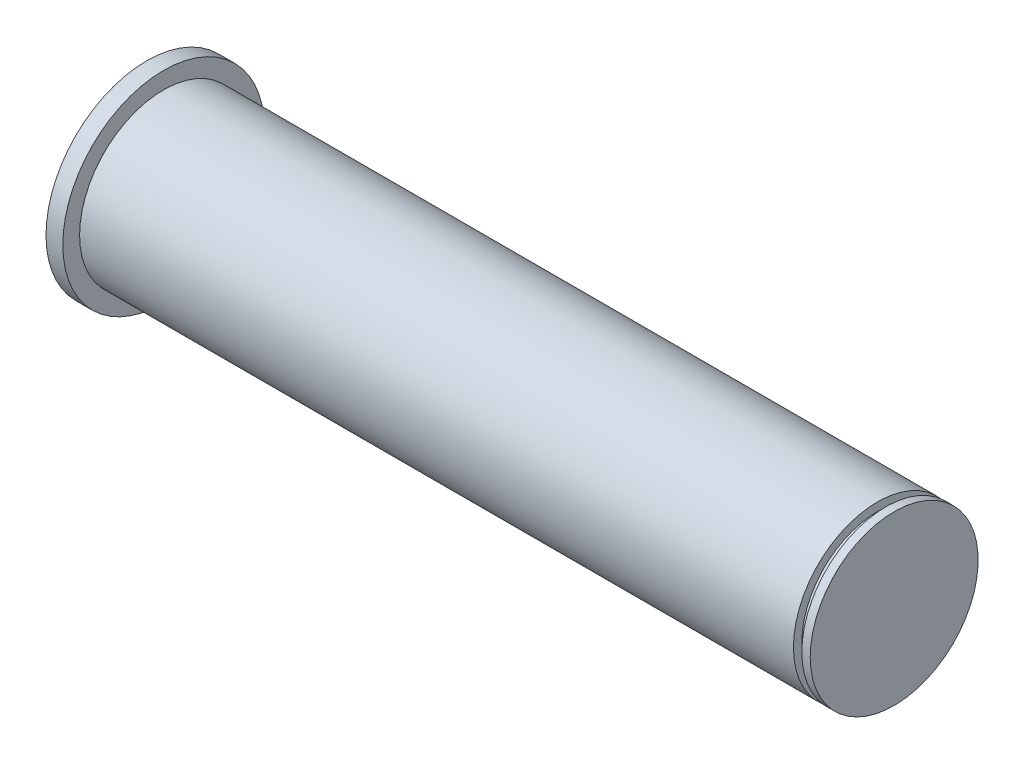
ISO-10303-21;
HEADER;
FILE_DESCRIPTION(('STEP AP214'),'2;1');
FILE_NAME('part.step','',(''),(''),'','','');
FILE_SCHEMA(('AUTOMOTIVE_DESIGN { 1 0 10303 214 1 1 1 1 }'));
ENDSEC;
DATA;
#1=APPLICATION_CONTEXT('core data for automotive mechanical design processes');
#2=APPLICATION_PROTOCOL_DEFINITION('international standard','automotive_design',2000,#1);
#3=PRODUCT_CONTEXT('',#1,'mechanical');
#4=PRODUCT('Part','Part','',(#3));
#5=PRODUCT_RELATED_PRODUCT_CATEGORY('part','',(#4));
#6=PRODUCT_DEFINITION_FORMATION('','',#4);
#7=PRODUCT_DEFINITION_CONTEXT('part definition',#1,'design');
#8=PRODUCT_DEFINITION('design','',#6,#7);
#9=PRODUCT_DEFINITION_SHAPE('','',#8);
#10=(LENGTH_UNIT() NAMED_UNIT(*) SI_UNIT(.MILLI.,.METRE.));
#11=(NAMED_UNIT(*) PLANE_ANGLE_UNIT() SI_UNIT($,.RADIAN.));
#12=(NAMED_UNIT(*) SI_UNIT($,.STERADIAN.) SOLID_ANGLE_UNIT());
#13=UNCERTAINTY_MEASURE_WITH_UNIT(LENGTH_MEASURE(1.E-05),#10,'distance_accuracy_value','');
#14=(GEOMETRIC_REPRESENTATION_CONTEXT(3) GLOBAL_UNCERTAINTY_ASSIGNED_CONTEXT((#13)) GLOBAL_UNIT_ASSIGNED_CONTEXT((#10,
#11,#12)) REPRESENTATION_CONTEXT('',''));
#15=CARTESIAN_POINT('',(0.,0.,0.));
#16=DIRECTION('',(0.,0.,1.));
#17=DIRECTION('',(1.,0.,0.));
#18=AXIS2_PLACEMENT_3D('',#15,#16,#17);
#19=CARTESIAN_POINT('',(0.,0.,0.));
#20=DIRECTION('',(1.,0.,0.));
#21=DIRECTION('',(0.,0.,-1.));
#22=AXIS2_PLACEMENT_3D('',#19,#20,#21);
#23=PLANE('',#22);
#24=CARTESIAN_POINT('',(0.,0.,0.));
#25=DIRECTION('',(-1.,0.,0.));
#26=DIRECTION('',(0.,0.,1.));
#27=AXIS2_PLACEMENT_3D('',#24,#25,#26);
#28=CIRCLE('',#27,12.);
#29=CARTESIAN_POINT('',(0.,0.,12.));
#30=VERTEX_POINT('',#29);
#31=EDGE_CURVE('E10',#30,#30,#28,.T.);
#32=ORIENTED_EDGE('',*,*,#31,.T.);
#33=EDGE_LOOP('',(#32));
#34=FACE_BOUND('',#33,.T.);
#35=ADVANCED_FACE('F31',(#34),#23,.F.);
#36=CARTESIAN_POINT('',(0.,0.,0.));
#37=DIRECTION('',(-1.,0.,0.));
#38=DIRECTION('',(0.,0.,1.));
#39=AXIS2_PLACEMENT_3D('',#36,#37,#38);
#40=CYLINDRICAL_SURFACE('',#39,12.);
#41=ORIENTED_EDGE('',*,*,#31,.F.);
#42=EDGE_LOOP('',(#41));
#43=FACE_BOUND('',#42,.T.);
#44=CARTESIAN_POINT('',(2.,0.,0.));
#45=DIRECTION('',(-1.,0.,0.));
#46=DIRECTION('',(0.,0.,1.));
#47=AXIS2_PLACEMENT_3D('',#44,#45,#46);
#48=CIRCLE('',#47,12.);
#49=CARTESIAN_POINT('',(2.,0.,12.));
#50=VERTEX_POINT('',#49);
#51=EDGE_CURVE('E37',#50,#50,#48,.T.);
#52=ORIENTED_EDGE('',*,*,#51,.T.);
#53=EDGE_LOOP('',(#52));
#54=FACE_BOUND('',#53,.T.);
#55=ADVANCED_FACE('F75',(#43,#54),#40,.T.);
#56=CARTESIAN_POINT('',(2.,12.,0.));
#57=DIRECTION('',(-1.,0.,0.));
#58=DIRECTION('',(0.,0.,1.));
#59=AXIS2_PLACEMENT_3D('',#56,#57,#58);
#60=PLANE('',#59);
#61=ORIENTED_EDGE('',*,*,#51,.F.);
#62=EDGE_LOOP('',(#61));
#63=FACE_BOUND('',#62,.T.);
#64=CARTESIAN_POINT('',(2.,0.,0.));
#65=DIRECTION('',(-1.,0.,0.));
#66=DIRECTION('',(0.,0.,1.));
#67=AXIS2_PLACEMENT_3D('',#64,#65,#66);
#68=CIRCLE('',#67,9.99999999999999);
#69=CARTESIAN_POINT('',(2.,0.,9.99999999999999));
#70=VERTEX_POINT('',#69);
#71=EDGE_CURVE('E41',#70,#70,#68,.T.);
#72=ORIENTED_EDGE('',*,*,#71,.T.);
#73=EDGE_LOOP('',(#72));
#74=FACE_BOUND('',#73,.T.);
#75=ADVANCED_FACE('F79',(#63,#74),#60,.F.);
#76=CARTESIAN_POINT('',(0.,0.,0.));
#77=DIRECTION('',(-1.,0.,0.));
#78=DIRECTION('',(0.,0.,1.));
#79=AXIS2_PLACEMENT_3D('',#76,#77,#78);
#80=CYLINDRICAL_SURFACE('',#79,9.99999999999998);
#81=ORIENTED_EDGE('',*,*,#71,.F.);
#82=EDGE_LOOP('',(#81));
#83=FACE_BOUND('',#82,.T.);
#84=CARTESIAN_POINT('',(87.,0.,0.));
#85=DIRECTION('',(-1.,0.,0.));
#86=DIRECTION('',(0.,0.,1.));
#87=AXIS2_PLACEMENT_3D('',#84,#85,#86);
#88=CIRCLE('',#87,9.99999999999998);
#89=CARTESIAN_POINT('',(87.,0.,9.99999999999998));
#90=VERTEX_POINT('',#89);
#91=EDGE_CURVE('E45',#90,#90,#88,.T.);
#92=ORIENTED_EDGE('',*,*,#91,.T.);
#93=EDGE_LOOP('',(#92));
#94=FACE_BOUND('',#93,.T.);
#95=ADVANCED_FACE('F84',(#83,#94),#80,.T.);
#96=CARTESIAN_POINT('',(87.,9.99999999999998,0.));
#97=DIRECTION('',(-1.,0.,0.));
#98=DIRECTION('',(0.,0.,1.));
#99=AXIS2_PLACEMENT_3D('',#96,#97,#98);
#100=PLANE('',#99);
#101=ORIENTED_EDGE('',*,*,#91,.F.);
#102=EDGE_LOOP('',(#101));
#103=FACE_BOUND('',#102,.T.);
#104=CARTESIAN_POINT('',(87.,0.,0.));
#105=DIRECTION('',(-1.,0.,0.));
#106=DIRECTION('',(0.,0.,1.));
#107=AXIS2_PLACEMENT_3D('',#104,#105,#106);
#108=CIRCLE('',#107,8.99999999999999);
#109=CARTESIAN_POINT('',(87.,0.,8.99999999999999));
#110=VERTEX_POINT('',#109);
#111=EDGE_CURVE('E50',#110,#110,#108,.T.);
#112=ORIENTED_EDGE('',*,*,#111,.T.);
#113=EDGE_LOOP('',(#112));
#114=FACE_BOUND('',#113,.T.);
#115=ADVANCED_FACE('F90',(#103,#114),#100,.F.);
#116=CARTESIAN_POINT('',(0.,0.,0.));
#117=DIRECTION('',(-1.,0.,0.));
#118=DIRECTION('',(0.,0.,1.));
#119=AXIS2_PLACEMENT_3D('',#116,#117,#118);
#120=CYLINDRICAL_SURFACE('',#119,8.99999999999999);
#121=ORIENTED_EDGE('',*,*,#111,.F.);
#122=EDGE_LOOP('',(#121));
#123=FACE_BOUND('',#122,.T.);
#124=CARTESIAN_POINT('',(88.,0.,0.));
#125=DIRECTION('',(-1.,0.,0.));
#126=DIRECTION('',(0.,0.,1.));
#127=AXIS2_PLACEMENT_3D('',#124,#125,#126);
#128=CIRCLE('',#127,8.99999999999999);
#129=CARTESIAN_POINT('',(88.,0.,8.99999999999999));
#130=VERTEX_POINT('',#129);
#131=EDGE_CURVE('E53',#130,#130,#128,.T.);
#132=ORIENTED_EDGE('',*,*,#131,.T.);
#133=EDGE_LOOP('',(#132));
#134=FACE_BOUND('',#133,.T.);
#135=ADVANCED_FACE('F94',(#123,#134),#120,.T.);
#136=CARTESIAN_POINT('',(88.,8.99999999999999,0.));
#137=DIRECTION('',(1.,0.,0.));
#138=DIRECTION('',(0.,0.,-1.));
#139=AXIS2_PLACEMENT_3D('',#136,#137,#138);
#140=PLANE('',#139);
#141=ORIENTED_EDGE('',*,*,#131,.F.);
#142=EDGE_LOOP('',(#141));
#143=FACE_BOUND('',#142,.T.);
#144=CARTESIAN_POINT('',(88.,0.,0.));
#145=DIRECTION('',(-1.,0.,0.));
#146=DIRECTION('',(0.,0.,1.));
#147=AXIS2_PLACEMENT_3D('',#144,#145,#146);
#148=CIRCLE('',#147,9.99999999999999);
#149=CARTESIAN_POINT('',(88.,0.,9.99999999999999));
#150=VERTEX_POINT('',#149);
#151=EDGE_CURVE('E56',#150,#150,#148,.T.);
#152=ORIENTED_EDGE('',*,*,#151,.T.);
#153=EDGE_LOOP('',(#152));
#154=FACE_BOUND('',#153,.T.);
#155=ADVANCED_FACE('F71',(#143,#154),#140,.F.);
#156=CARTESIAN_POINT('',(0.,0.,0.));
#157=DIRECTION('',(-1.,0.,0.));
#158=DIRECTION('',(0.,0.,1.));
#159=AXIS2_PLACEMENT_3D('',#156,#157,#158);
#160=CYLINDRICAL_SURFACE('',#159,9.99999999999999);
#161=ORIENTED_EDGE('',*,*,#151,.F.);
#162=EDGE_LOOP('',(#161));
#163=FACE_BOUND('',#162,.T.);
#164=CARTESIAN_POINT('',(89.,0.,0.));
#165=DIRECTION('',(-1.,0.,0.));
#166=DIRECTION('',(0.,0.,1.));
#167=AXIS2_PLACEMENT_3D('',#164,#165,#166);
#168=CIRCLE('',#167,9.99999999999999);
#169=CARTESIAN_POINT('',(89.,0.,9.99999999999999));
#170=VERTEX_POINT('',#169);
#171=EDGE_CURVE('E59',#170,#170,#168,.T.);
#172=ORIENTED_EDGE('',*,*,#171,.T.);
#173=EDGE_LOOP('',(#172));
#174=FACE_BOUND('',#173,.T.);
#175=ADVANCED_FACE('F63',(#163,#174),#160,.T.);
#176=CARTESIAN_POINT('',(89.,9.99999999999999,0.));
#177=DIRECTION('',(-1.,0.,0.));
#178=DIRECTION('',(0.,0.,1.));
#179=AXIS2_PLACEMENT_3D('',#176,#177,#178);
#180=PLANE('',#179);
#181=ORIENTED_EDGE('',*,*,#171,.F.);
#182=EDGE_LOOP('',(#181));
#183=FACE_BOUND('',#182,.T.);
#184=ADVANCED_FACE('F65',(#183),#180,.F.);
#185=CLOSED_SHELL('',(#35,#55,#75,#95,#115,#135,#155,#175,#184));
#186=MANIFOLD_SOLID_BREP('B2',#185);
#187=ADVANCED_BREP_SHAPE_REPRESENTATION('',(#18,#186),#14);
#188=SHAPE_DEFINITION_REPRESENTATION(#9,#187);
ENDSEC;
END-ISO-10303-21;
